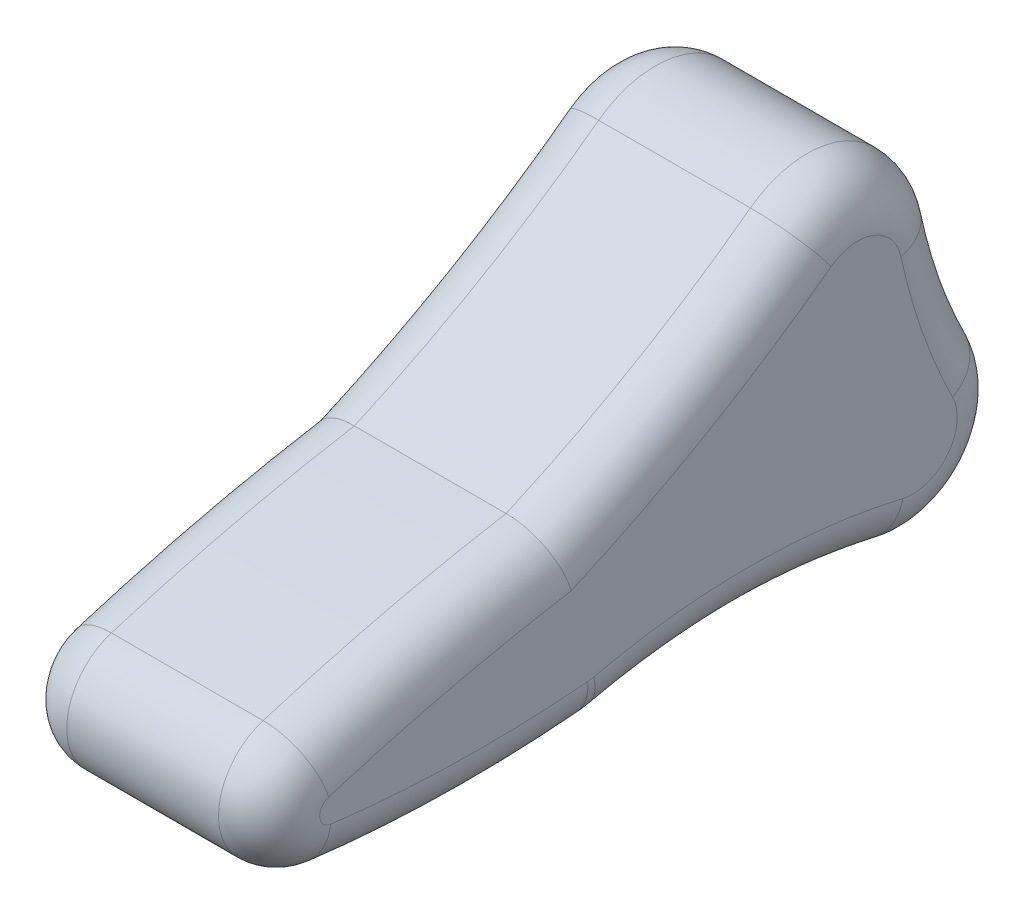
ISO-10303-21;
HEADER;
FILE_DESCRIPTION(('STEP AP214'),'2;1');
FILE_NAME('part.step','',(''),(''),'','','');
FILE_SCHEMA(('AUTOMOTIVE_DESIGN { 1 0 10303 214 1 1 1 1 }'));
ENDSEC;
DATA;
#1=APPLICATION_CONTEXT('core data for automotive mechanical design processes');
#2=APPLICATION_PROTOCOL_DEFINITION('international standard','automotive_design',2000,#1);
#3=PRODUCT_CONTEXT('',#1,'mechanical');
#4=PRODUCT('Part','Part','',(#3));
#5=PRODUCT_RELATED_PRODUCT_CATEGORY('part','',(#4));
#6=PRODUCT_DEFINITION_FORMATION('','',#4);
#7=PRODUCT_DEFINITION_CONTEXT('part definition',#1,'design');
#8=PRODUCT_DEFINITION('design','',#6,#7);
#9=PRODUCT_DEFINITION_SHAPE('','',#8);
#10=(LENGTH_UNIT() NAMED_UNIT(*) SI_UNIT(.MILLI.,.METRE.));
#11=(NAMED_UNIT(*) PLANE_ANGLE_UNIT() SI_UNIT($,.RADIAN.));
#12=(NAMED_UNIT(*) SI_UNIT($,.STERADIAN.) SOLID_ANGLE_UNIT());
#13=UNCERTAINTY_MEASURE_WITH_UNIT(LENGTH_MEASURE(1.E-05),#10,'distance_accuracy_value','');
#14=(GEOMETRIC_REPRESENTATION_CONTEXT(3) GLOBAL_UNCERTAINTY_ASSIGNED_CONTEXT((#13)) GLOBAL_UNIT_ASSIGNED_CONTEXT((#10,
#11,#12)) REPRESENTATION_CONTEXT('',''));
#15=CARTESIAN_POINT('',(0.,0.,0.));
#16=DIRECTION('',(0.,0.,1.));
#17=DIRECTION('',(1.,0.,0.));
#18=AXIS2_PLACEMENT_3D('',#15,#16,#17);
#19=CARTESIAN_POINT('',(165.1,-721.036665442336,300.274692445142));
#20=DIRECTION('',(-1.,0.,0.));
#21=DIRECTION('',(0.,0.,1.));
#22=AXIS2_PLACEMENT_3D('',#19,#20,#21);
#23=CYLINDRICAL_SURFACE('',#22,508.);
#24=DIRECTION('',(-1.,0.,0.));
#25=VECTOR('',#24,1.);
#26=CARTESIAN_POINT('',(114.3,-1185.70392378103,94.9740859482165));
#27=LINE('',#26,#25);
#28=CARTESIAN_POINT('',(144.78,-1185.70392378103,94.9740859482165));
#29=VERTEX_POINT('',#28);
#30=CARTESIAN_POINT('',(83.82,-1185.70392378103,94.9740859482165));
#31=VERTEX_POINT('',#30);
#32=EDGE_CURVE('E370',#29,#31,#27,.T.);
#33=ORIENTED_EDGE('',*,*,#32,.F.);
#34=CARTESIAN_POINT('',(144.78,-721.036665442336,300.274692445142));
#35=DIRECTION('',(-1.,0.,0.));
#36=DIRECTION('',(0.,0.,1.));
#37=AXIS2_PLACEMENT_3D('',#34,#35,#36);
#38=CIRCLE('',#37,508.);
#39=CARTESIAN_POINT('',(144.78,-1128.45838360628,-3.15823847756048));
#40=VERTEX_POINT('',#39);
#41=EDGE_CURVE('E223',#29,#40,#38,.F.);
#42=ORIENTED_EDGE('',*,*,#41,.T.);
#43=DIRECTION('',(-1.,0.,0.));
#44=VECTOR('',#43,1.);
#45=CARTESIAN_POINT('',(165.1,-1128.45838360628,-3.15823847756048));
#46=LINE('',#45,#44);
#47=CARTESIAN_POINT('',(83.82,-1128.45838360628,-3.15823847756048));
#48=VERTEX_POINT('',#47);
#49=EDGE_CURVE('E342',#40,#48,#46,.T.);
#50=ORIENTED_EDGE('',*,*,#49,.T.);
#51=CARTESIAN_POINT('',(83.82,-721.036665442336,300.274692445142));
#52=DIRECTION('',(-1.,0.,0.));
#53=DIRECTION('',(0.,0.,1.));
#54=AXIS2_PLACEMENT_3D('',#51,#52,#53);
#55=CIRCLE('',#54,508.);
#56=EDGE_CURVE('E221',#48,#31,#55,.T.);
#57=ORIENTED_EDGE('',*,*,#56,.T.);
#58=EDGE_LOOP('',(#33,#42,#50,#57));
#59=FACE_BOUND('',#58,.T.);
#60=ADVANCED_FACE('F33',(#59),#23,.F.);
#61=CARTESIAN_POINT('',(165.1,-1103.40350261757,-286.75330139272));
#62=DIRECTION('',(-1.,0.,0.));
#63=DIRECTION('',(0.,0.,1.));
#64=AXIS2_PLACEMENT_3D('',#61,#62,#63);
#65=CYLINDRICAL_SURFACE('',#64,228.6);
#66=DIRECTION('',(-1.,0.,0.));
#67=VECTOR('',#66,1.);
#68=CARTESIAN_POINT('',(165.1,-1151.07051106129,-63.1782215961856));
#69=LINE('',#68,#67);
#70=CARTESIAN_POINT('',(144.78,-1151.07051106129,-63.1782215961856));
#71=VERTEX_POINT('',#70);
#72=CARTESIAN_POINT('',(83.82,-1151.07051106129,-63.1782215961856));
#73=VERTEX_POINT('',#72);
#74=EDGE_CURVE('E178',#71,#73,#69,.T.);
#75=ORIENTED_EDGE('',*,*,#74,.F.);
#76=CARTESIAN_POINT('',(144.78,-1103.40350261757,-286.75330139272));
#77=DIRECTION('',(-1.,0.,0.));
#78=DIRECTION('',(0.,0.,1.));
#79=AXIS2_PLACEMENT_3D('',#76,#77,#78);
#80=CIRCLE('',#79,228.6);
#81=CARTESIAN_POINT('',(144.78,-1205.49908248986,-82.2185792291186));
#82=VERTEX_POINT('',#81);
#83=EDGE_CURVE('E194',#71,#82,#80,.F.);
#84=ORIENTED_EDGE('',*,*,#83,.T.);
#85=DIRECTION('',(-1.,0.,0.));
#86=VECTOR('',#85,1.);
#87=CARTESIAN_POINT('',(165.1,-1205.49908248986,-82.2185792291186));
#88=LINE('',#87,#86);
#89=CARTESIAN_POINT('',(83.82,-1205.49908248986,-82.2185792291186));
#90=VERTEX_POINT('',#89);
#91=EDGE_CURVE('E337',#82,#90,#88,.T.);
#92=ORIENTED_EDGE('',*,*,#91,.T.);
#93=CARTESIAN_POINT('',(83.82,-1103.40350261757,-286.75330139272));
#94=DIRECTION('',(-1.,0.,0.));
#95=DIRECTION('',(0.,0.,1.));
#96=AXIS2_PLACEMENT_3D('',#93,#94,#95);
#97=CIRCLE('',#96,228.6);
#98=EDGE_CURVE('E192',#90,#73,#97,.T.);
#99=ORIENTED_EDGE('',*,*,#98,.T.);
#100=EDGE_LOOP('',(#75,#84,#92,#99));
#101=FACE_BOUND('',#100,.T.);
#102=ADVANCED_FACE('F335',(#101),#65,.F.);
#103=CARTESIAN_POINT('',(165.1,-1159.01501246857,-25.9157082967632));
#104=DIRECTION('',(-1.,0.,0.));
#105=DIRECTION('',(0.,0.,1.));
#106=AXIS2_PLACEMENT_3D('',#103,#104,#105);
#107=CYLINDRICAL_SURFACE('',#106,38.1);
#108=ORIENTED_EDGE('',*,*,#49,.F.);
#109=CARTESIAN_POINT('',(144.78,-1159.01501246857,-25.9157082967632));
#110=DIRECTION('',(-1.,0.,0.));
#111=DIRECTION('',(0.,0.,1.));
#112=AXIS2_PLACEMENT_3D('',#109,#110,#111);
#113=CIRCLE('',#112,38.1);
#114=EDGE_CURVE('E165',#40,#71,#113,.T.);
#115=ORIENTED_EDGE('',*,*,#114,.T.);
#116=ORIENTED_EDGE('',*,*,#74,.T.);
#117=CARTESIAN_POINT('',(83.82,-1159.01501246857,-25.9157082967632));
#118=DIRECTION('',(-1.,0.,0.));
#119=DIRECTION('',(0.,0.,1.));
#120=AXIS2_PLACEMENT_3D('',#117,#118,#119);
#121=CIRCLE('',#120,38.1);
#122=EDGE_CURVE('E184',#73,#48,#121,.F.);
#123=ORIENTED_EDGE('',*,*,#122,.T.);
#124=EDGE_LOOP('',(#108,#115,#116,#123));
#125=FACE_BOUND('',#124,.T.);
#126=ADVANCED_FACE('F340',(#125),#107,.T.);
#127=CARTESIAN_POINT('',(165.1,-1222.51501246857,84.0695179838607));
#128=DIRECTION('',(-1.,0.,0.));
#129=DIRECTION('',(0.,0.,1.));
#130=AXIS2_PLACEMENT_3D('',#127,#128,#129);
#131=CYLINDRICAL_SURFACE('',#130,38.1000000000002);
#132=DIRECTION('',(-1.,0.,0.));
#133=VECTOR('',#132,1.);
#134=CARTESIAN_POINT('',(165.1,-1259.62669209869,75.4478455804447));
#135=LINE('',#134,#133);
#136=CARTESIAN_POINT('',(144.78,-1259.62669209869,75.4478455804447));
#137=VERTEX_POINT('',#136);
#138=CARTESIAN_POINT('',(83.82,-1259.62669209869,75.4478455804447));
#139=VERTEX_POINT('',#138);
#140=EDGE_CURVE('E344',#137,#139,#135,.T.);
#141=ORIENTED_EDGE('',*,*,#140,.F.);
#142=CARTESIAN_POINT('',(144.78,-1222.51501246857,84.0695179838607));
#143=DIRECTION('',(-1.,0.,0.));
#144=DIRECTION('',(0.,0.,1.));
#145=AXIS2_PLACEMENT_3D('',#142,#143,#144);
#146=CIRCLE('',#145,38.1000000000002);
#147=CARTESIAN_POINT('',(144.78,-1260.4716735161,80.7677181529781));
#148=VERTEX_POINT('',#147);
#149=EDGE_CURVE('E206',#137,#148,#146,.T.);
#150=ORIENTED_EDGE('',*,*,#149,.T.);
#151=DIRECTION('',(-1.,0.,0.));
#152=VECTOR('',#151,1.);
#153=CARTESIAN_POINT('',(165.1,-1260.4716735161,80.7677181529781));
#154=LINE('',#153,#152);
#155=CARTESIAN_POINT('',(83.82,-1260.4716735161,80.7677181529781));
#156=VERTEX_POINT('',#155);
#157=EDGE_CURVE('E401',#148,#156,#154,.T.);
#158=ORIENTED_EDGE('',*,*,#157,.T.);
#159=CARTESIAN_POINT('',(83.82,-1222.51501246857,84.0695179838607));
#160=DIRECTION('',(-1.,0.,0.));
#161=DIRECTION('',(0.,0.,1.));
#162=AXIS2_PLACEMENT_3D('',#159,#160,#161);
#163=CIRCLE('',#162,38.1000000000002);
#164=EDGE_CURVE('E204',#156,#139,#163,.F.);
#165=ORIENTED_EDGE('',*,*,#164,.T.);
#166=EDGE_LOOP('',(#141,#150,#158,#165));
#167=FACE_BOUND('',#166,.T.);
#168=ADVANCED_FACE('F423',(#167),#131,.T.);
#169=CARTESIAN_POINT('',(165.1,-1507.03788963278,17.9700295576713));
#170=DIRECTION('',(-1.,0.,0.));
#171=DIRECTION('',(0.,0.,1.));
#172=AXIS2_PLACEMENT_3D('',#169,#170,#171);
#173=CYLINDRICAL_SURFACE('',#172,254.);
#174=DIRECTION('',(-1.,0.,0.));
#175=VECTOR('',#174,1.);
#176=CARTESIAN_POINT('',(165.1,-1259.62669209869,-39.5077864651021));
#177=LINE('',#176,#175);
#178=CARTESIAN_POINT('',(144.78,-1259.62669209869,-39.5077864651021));
#179=VERTEX_POINT('',#178);
#180=CARTESIAN_POINT('',(83.82,-1259.62669209869,-39.5077864651021));
#181=VERTEX_POINT('',#180);
#182=EDGE_CURVE('E369',#179,#181,#177,.T.);
#183=ORIENTED_EDGE('',*,*,#182,.F.);
#184=CARTESIAN_POINT('',(144.78,-1507.03788963278,17.9700295576713));
#185=DIRECTION('',(-1.,0.,0.));
#186=DIRECTION('',(0.,0.,1.));
#187=AXIS2_PLACEMENT_3D('',#184,#185,#186);
#188=CIRCLE('',#187,254.);
#189=EDGE_CURVE('E202',#179,#137,#188,.F.);
#190=ORIENTED_EDGE('',*,*,#189,.T.);
#191=ORIENTED_EDGE('',*,*,#140,.T.);
#192=CARTESIAN_POINT('',(83.82,-1507.03788963278,17.9700295576713));
#193=DIRECTION('',(-1.,0.,0.));
#194=DIRECTION('',(0.,0.,1.));
#195=AXIS2_PLACEMENT_3D('',#192,#193,#194);
#196=CIRCLE('',#195,254.);
#197=EDGE_CURVE('E200',#139,#181,#196,.T.);
#198=ORIENTED_EDGE('',*,*,#197,.T.);
#199=EDGE_LOOP('',(#183,#190,#191,#198));
#200=FACE_BOUND('',#199,.T.);
#201=ADVANCED_FACE('F381',(#200),#173,.F.);
#202=CARTESIAN_POINT('',(165.1,-1222.51501246857,-48.1294588685182));
#203=DIRECTION('',(-1.,0.,0.));
#204=DIRECTION('',(0.,0.,1.));
#205=AXIS2_PLACEMENT_3D('',#202,#203,#204);
#206=CYLINDRICAL_SURFACE('',#205,38.1000000000002);
#207=ORIENTED_EDGE('',*,*,#91,.F.);
#208=CARTESIAN_POINT('',(144.78,-1222.51501246857,-48.1294588685182));
#209=DIRECTION('',(-1.,0.,0.));
#210=DIRECTION('',(0.,0.,1.));
#211=AXIS2_PLACEMENT_3D('',#208,#209,#210);
#212=CIRCLE('',#211,38.1000000000002);
#213=EDGE_CURVE('E198',#82,#179,#212,.T.);
#214=ORIENTED_EDGE('',*,*,#213,.T.);
#215=ORIENTED_EDGE('',*,*,#182,.T.);
#216=CARTESIAN_POINT('',(83.82,-1222.51501246857,-48.1294588685182));
#217=DIRECTION('',(-1.,0.,0.));
#218=DIRECTION('',(0.,0.,1.));
#219=AXIS2_PLACEMENT_3D('',#216,#217,#218);
#220=CIRCLE('',#219,38.1000000000002);
#221=EDGE_CURVE('E196',#181,#90,#220,.F.);
#222=ORIENTED_EDGE('',*,*,#221,.T.);
#223=EDGE_LOOP('',(#207,#214,#215,#222));
#224=FACE_BOUND('',#223,.T.);
#225=ADVANCED_FACE('F366',(#224),#206,.T.);
#226=CARTESIAN_POINT('',(165.1,-1131.20925754307,-156.334504844742));
#227=DIRECTION('',(-1.,0.,0.));
#228=DIRECTION('',(0.,0.,1.));
#229=AXIS2_PLACEMENT_3D('',#226,#227,#228);
#230=PLANE('',#229);
#231=CARTESIAN_POINT('',(165.1,-1103.40350261757,-286.75330139272));
#232=DIRECTION('',(-1.,0.,0.));
#233=DIRECTION('',(0.,0.,1.));
#234=AXIS2_PLACEMENT_3D('',#231,#232,#233);
#235=CIRCLE('',#234,248.92);
#236=CARTESIAN_POINT('',(165.1,-1214.57424514517,-64.0377150367985));
#237=VERTEX_POINT('',#236);
#238=CARTESIAN_POINT('',(165.1,-1155.30757847851,-43.304881169827));
#239=VERTEX_POINT('',#238);
#240=EDGE_CURVE('E182',#237,#239,#235,.T.);
#241=ORIENTED_EDGE('',*,*,#240,.T.);
#242=CARTESIAN_POINT('',(165.1,-1159.01501246857,-25.9157082967632));
#243=DIRECTION('',(-1.,0.,0.));
#244=DIRECTION('',(0.,0.,1.));
#245=AXIS2_PLACEMENT_3D('',#242,#243,#244);
#246=CIRCLE('',#245,17.78);
#247=CARTESIAN_POINT('',(165.1,-1144.75525233284,-15.2955557144687));
#248=VERTEX_POINT('',#247);
#249=EDGE_CURVE('E163',#239,#248,#246,.F.);
#250=ORIENTED_EDGE('',*,*,#249,.T.);
#251=CARTESIAN_POINT('',(165.1,-721.036665442336,300.274692445142));
#252=DIRECTION('',(-1.,0.,0.));
#253=DIRECTION('',(0.,0.,1.));
#254=AXIS2_PLACEMENT_3D('',#251,#252,#253);
#255=CIRCLE('',#254,528.32);
#256=CARTESIAN_POINT('',(165.1,-1205.32684173991,89.1229755644506));
#257=VERTEX_POINT('',#256);
#258=EDGE_CURVE('E171',#248,#257,#255,.T.);
#259=ORIENTED_EDGE('',*,*,#258,.T.);
#260=CARTESIAN_POINT('',(165.1,-1937.01800195655,-32.1917739956208));
#261=DIRECTION('',(-1.,0.,0.));
#262=DIRECTION('',(0.,0.,1.));
#263=AXIS2_PLACEMENT_3D('',#260,#261,#262);
#264=CIRCLE('',#263,741.68);
#265=CARTESIAN_POINT('',(165.1,-1228.34510342367,186.604810267022));
#266=VERTEX_POINT('',#265);
#267=EDGE_CURVE('E177',#257,#266,#264,.F.);
#268=ORIENTED_EDGE('',*,*,#267,.T.);
#269=CARTESIAN_POINT('',(165.1,-1233.19902738622,185.106203525497));
#270=DIRECTION('',(-1.,0.,0.));
#271=DIRECTION('',(0.,0.,1.));
#272=AXIS2_PLACEMENT_3D('',#269,#270,#271);
#273=CIRCLE('',#272,5.07999999999997);
#274=CARTESIAN_POINT('',(165.1,-1238.23919757398,185.741092868943));
#275=VERTEX_POINT('',#274);
#276=EDGE_CURVE('E349',#266,#275,#273,.F.);
#277=ORIENTED_EDGE('',*,*,#276,.T.);
#278=CARTESIAN_POINT('',(165.1,-754.382859549086,124.791715898082));
#279=DIRECTION('',(-1.,0.,0.));
#280=DIRECTION('',(0.,0.,1.));
#281=AXIS2_PLACEMENT_3D('',#278,#279,#280);
#282=CIRCLE('',#281,487.68);
#283=CARTESIAN_POINT('',(165.1,-1240.22812095742,82.5286780627822));
#284=VERTEX_POINT('',#283);
#285=EDGE_CURVE('E351',#275,#284,#282,.F.);
#286=ORIENTED_EDGE('',*,*,#285,.T.);
#287=CARTESIAN_POINT('',(165.1,-1222.51501246857,84.0695179838607));
#288=DIRECTION('',(-1.,0.,0.));
#289=DIRECTION('',(0.,0.,1.));
#290=AXIS2_PLACEMENT_3D('',#287,#288,#289);
#291=CIRCLE('',#290,17.7800000000002);
#292=CARTESIAN_POINT('',(165.1,-1239.83379629596,80.0460708622666));
#293=VERTEX_POINT('',#292);
#294=EDGE_CURVE('E353',#284,#293,#291,.F.);
#295=ORIENTED_EDGE('',*,*,#294,.T.);
#296=CARTESIAN_POINT('',(165.1,-1507.03788963278,17.9700295576713));
#297=DIRECTION('',(-1.,0.,0.));
#298=DIRECTION('',(0.,0.,1.));
#299=AXIS2_PLACEMENT_3D('',#296,#297,#298);
#300=CIRCLE('',#299,274.32);
#301=CARTESIAN_POINT('',(165.1,-1239.83379629596,-44.106011746924));
#302=VERTEX_POINT('',#301);
#303=EDGE_CURVE('E355',#293,#302,#300,.T.);
#304=ORIENTED_EDGE('',*,*,#303,.T.);
#305=CARTESIAN_POINT('',(165.1,-1222.51501246857,-48.1294588685182));
#306=DIRECTION('',(-1.,0.,0.));
#307=DIRECTION('',(0.,0.,1.));
#308=AXIS2_PLACEMENT_3D('',#305,#306,#307);
#309=CIRCLE('',#308,17.7800000000002);
#310=EDGE_CURVE('E187',#302,#237,#309,.F.);
#311=ORIENTED_EDGE('',*,*,#310,.T.);
#312=EDGE_LOOP('',(#241,#250,#259,#268,#277,#286,#295,#304,#311));
#313=FACE_BOUND('',#312,.T.);
#314=ADVANCED_FACE('F180',(#313),#230,.F.);
#315=CARTESIAN_POINT('',(63.5,-1131.20925754307,-156.334504844742));
#316=DIRECTION('',(-1.,0.,0.));
#317=DIRECTION('',(0.,0.,1.));
#318=AXIS2_PLACEMENT_3D('',#315,#316,#317);
#319=PLANE('',#318);
#320=CARTESIAN_POINT('',(63.5,-754.382859549086,124.791715898082));
#321=DIRECTION('',(-1.,0.,0.));
#322=DIRECTION('',(0.,0.,1.));
#323=AXIS2_PLACEMENT_3D('',#320,#321,#322);
#324=CIRCLE('',#323,487.68);
#325=CARTESIAN_POINT('',(63.5,-1240.22812095742,82.5286780627823));
#326=VERTEX_POINT('',#325);
#327=CARTESIAN_POINT('',(63.5,-1238.23919757398,185.741092868943));
#328=VERTEX_POINT('',#327);
#329=EDGE_CURVE('E42',#326,#328,#324,.T.);
#330=ORIENTED_EDGE('',*,*,#329,.T.);
#331=CARTESIAN_POINT('',(63.5,-1233.19902738622,185.106203525497));
#332=DIRECTION('',(-1.,0.,0.));
#333=DIRECTION('',(0.,0.,1.));
#334=AXIS2_PLACEMENT_3D('',#331,#332,#333);
#335=CIRCLE('',#334,5.07999999999997);
#336=CARTESIAN_POINT('',(63.5,-1228.34510342367,186.604810267022));
#337=VERTEX_POINT('',#336);
#338=EDGE_CURVE('E11',#328,#337,#335,.T.);
#339=ORIENTED_EDGE('',*,*,#338,.T.);
#340=CARTESIAN_POINT('',(63.5,-1937.01800195655,-32.1917739956208));
#341=DIRECTION('',(-1.,0.,0.));
#342=DIRECTION('',(0.,0.,1.));
#343=AXIS2_PLACEMENT_3D('',#340,#341,#342);
#344=CIRCLE('',#343,741.68);
#345=CARTESIAN_POINT('',(63.5,-1205.32684173991,89.1229755644506));
#346=VERTEX_POINT('',#345);
#347=EDGE_CURVE('E225',#337,#346,#344,.T.);
#348=ORIENTED_EDGE('',*,*,#347,.T.);
#349=CARTESIAN_POINT('',(63.5,-721.036665442336,300.274692445142));
#350=DIRECTION('',(-1.,0.,0.));
#351=DIRECTION('',(0.,0.,1.));
#352=AXIS2_PLACEMENT_3D('',#349,#350,#351);
#353=CIRCLE('',#352,528.32);
#354=CARTESIAN_POINT('',(63.5,-1144.75525233284,-15.2955557144687));
#355=VERTEX_POINT('',#354);
#356=EDGE_CURVE('E227',#346,#355,#353,.F.);
#357=ORIENTED_EDGE('',*,*,#356,.T.);
#358=CARTESIAN_POINT('',(63.5,-1159.01501246857,-25.9157082967632));
#359=DIRECTION('',(-1.,0.,0.));
#360=DIRECTION('',(0.,0.,1.));
#361=AXIS2_PLACEMENT_3D('',#358,#359,#360);
#362=CIRCLE('',#361,17.78);
#363=CARTESIAN_POINT('',(63.5,-1155.30757847851,-43.304881169827));
#364=VERTEX_POINT('',#363);
#365=EDGE_CURVE('E229',#355,#364,#362,.T.);
#366=ORIENTED_EDGE('',*,*,#365,.T.);
#367=CARTESIAN_POINT('',(63.5,-1103.40350261757,-286.75330139272));
#368=DIRECTION('',(-1.,0.,0.));
#369=DIRECTION('',(0.,0.,1.));
#370=AXIS2_PLACEMENT_3D('',#367,#368,#369);
#371=CIRCLE('',#370,248.92);
#372=CARTESIAN_POINT('',(63.5,-1214.57424514517,-64.0377150367986));
#373=VERTEX_POINT('',#372);
#374=EDGE_CURVE('E231',#364,#373,#371,.F.);
#375=ORIENTED_EDGE('',*,*,#374,.T.);
#376=CARTESIAN_POINT('',(63.5,-1222.51501246857,-48.1294588685182));
#377=DIRECTION('',(-1.,0.,0.));
#378=DIRECTION('',(0.,0.,1.));
#379=AXIS2_PLACEMENT_3D('',#376,#377,#378);
#380=CIRCLE('',#379,17.7800000000002);
#381=CARTESIAN_POINT('',(63.5,-1239.83379629596,-44.106011746924));
#382=VERTEX_POINT('',#381);
#383=EDGE_CURVE('E233',#373,#382,#380,.T.);
#384=ORIENTED_EDGE('',*,*,#383,.T.);
#385=CARTESIAN_POINT('',(63.5,-1507.03788963278,17.9700295576713));
#386=DIRECTION('',(-1.,0.,0.));
#387=DIRECTION('',(0.,0.,1.));
#388=AXIS2_PLACEMENT_3D('',#385,#386,#387);
#389=CIRCLE('',#388,274.32);
#390=CARTESIAN_POINT('',(63.5,-1239.83379629596,80.0460708622665));
#391=VERTEX_POINT('',#390);
#392=EDGE_CURVE('E235',#382,#391,#389,.F.);
#393=ORIENTED_EDGE('',*,*,#392,.T.);
#394=CARTESIAN_POINT('',(63.5,-1222.51501246857,84.0695179838607));
#395=DIRECTION('',(-1.,0.,0.));
#396=DIRECTION('',(0.,0.,1.));
#397=AXIS2_PLACEMENT_3D('',#394,#395,#396);
#398=CIRCLE('',#397,17.7800000000002);
#399=EDGE_CURVE('E53',#391,#326,#398,.T.);
#400=ORIENTED_EDGE('',*,*,#399,.T.);
#401=EDGE_LOOP('',(#330,#339,#348,#357,#366,#375,#384,#393,#400));
#402=FACE_BOUND('',#401,.T.);
#403=ADVANCED_FACE('F439',(#402),#319,.T.);
#404=CARTESIAN_POINT('',(165.1,-1937.01800195655,-32.1917739956208));
#405=DIRECTION('',(-1.,0.,0.));
#406=DIRECTION('',(0.,0.,1.));
#407=AXIS2_PLACEMENT_3D('',#404,#405,#406);
#408=CYLINDRICAL_SURFACE('',#407,762.);
#409=DIRECTION('',(-1.,0.,0.));
#410=VECTOR('',#409,1.);
#411=CARTESIAN_POINT('',(165.1,-1208.92940757345,192.599237233121));
#412=LINE('',#411,#410);
#413=CARTESIAN_POINT('',(144.78,-1208.92940757345,192.599237233121));
#414=VERTEX_POINT('',#413);
#415=CARTESIAN_POINT('',(83.82,-1208.92940757345,192.599237233121));
#416=VERTEX_POINT('',#415);
#417=EDGE_CURVE('E374',#414,#416,#412,.T.);
#418=ORIENTED_EDGE('',*,*,#417,.F.);
#419=CARTESIAN_POINT('',(144.78,-1937.01800195655,-32.1917739956208));
#420=DIRECTION('',(-1.,0.,0.));
#421=DIRECTION('',(0.,0.,1.));
#422=AXIS2_PLACEMENT_3D('',#419,#420,#421);
#423=CIRCLE('',#422,762.);
#424=EDGE_CURVE('E219',#414,#29,#423,.T.);
#425=ORIENTED_EDGE('',*,*,#424,.T.);
#426=ORIENTED_EDGE('',*,*,#32,.T.);
#427=CARTESIAN_POINT('',(83.82,-1937.01800195655,-32.1917739956208));
#428=DIRECTION('',(-1.,0.,0.));
#429=DIRECTION('',(0.,0.,1.));
#430=AXIS2_PLACEMENT_3D('',#427,#428,#429);
#431=CIRCLE('',#430,762.);
#432=EDGE_CURVE('E217',#31,#416,#431,.F.);
#433=ORIENTED_EDGE('',*,*,#432,.T.);
#434=EDGE_LOOP('',(#418,#425,#426,#433));
#435=FACE_BOUND('',#434,.T.);
#436=ADVANCED_FACE('F580',(#435),#408,.T.);
#437=CARTESIAN_POINT('',(165.1,-1233.19902738622,185.106203525497));
#438=DIRECTION('',(-1.,0.,0.));
#439=DIRECTION('',(0.,0.,1.));
#440=AXIS2_PLACEMENT_3D('',#437,#438,#439);
#441=CYLINDRICAL_SURFACE('',#440,25.4);
#442=DIRECTION('',(-1.,0.,0.));
#443=VECTOR('',#442,1.);
#444=CARTESIAN_POINT('',(165.1,-1258.39987832502,188.280650242729));
#445=LINE('',#444,#443);
#446=CARTESIAN_POINT('',(144.78,-1258.39987832502,188.280650242729));
#447=VERTEX_POINT('',#446);
#448=CARTESIAN_POINT('',(83.82,-1258.39987832502,188.280650242729));
#449=VERTEX_POINT('',#448);
#450=EDGE_CURVE('E427',#447,#449,#445,.T.);
#451=ORIENTED_EDGE('',*,*,#450,.F.);
#452=CARTESIAN_POINT('',(144.78,-1233.19902738622,185.106203525497));
#453=DIRECTION('',(-1.,0.,0.));
#454=DIRECTION('',(0.,0.,1.));
#455=AXIS2_PLACEMENT_3D('',#452,#453,#454);
#456=CIRCLE('',#455,25.4);
#457=EDGE_CURVE('E215',#447,#414,#456,.T.);
#458=ORIENTED_EDGE('',*,*,#457,.T.);
#459=ORIENTED_EDGE('',*,*,#417,.T.);
#460=CARTESIAN_POINT('',(83.82,-1233.19902738622,185.106203525497));
#461=DIRECTION('',(-1.,0.,0.));
#462=DIRECTION('',(0.,0.,1.));
#463=AXIS2_PLACEMENT_3D('',#460,#461,#462);
#464=CIRCLE('',#463,25.4);
#465=EDGE_CURVE('E212',#416,#449,#464,.F.);
#466=ORIENTED_EDGE('',*,*,#465,.T.);
#467=EDGE_LOOP('',(#451,#458,#459,#466));
#468=FACE_BOUND('',#467,.T.);
#469=ADVANCED_FACE('F434',(#468),#441,.T.);
#470=CARTESIAN_POINT('',(165.1,-754.382859549086,124.791715898082));
#471=DIRECTION('',(-1.,0.,0.));
#472=DIRECTION('',(0.,0.,1.));
#473=AXIS2_PLACEMENT_3D('',#470,#471,#472);
#474=CYLINDRICAL_SURFACE('',#473,508.);
#475=ORIENTED_EDGE('',*,*,#157,.F.);
#476=CARTESIAN_POINT('',(144.78,-754.382859549086,124.791715898082));
#477=DIRECTION('',(-1.,0.,0.));
#478=DIRECTION('',(0.,0.,1.));
#479=AXIS2_PLACEMENT_3D('',#476,#477,#478);
#480=CIRCLE('',#479,508.);
#481=EDGE_CURVE('E210',#148,#447,#480,.T.);
#482=ORIENTED_EDGE('',*,*,#481,.T.);
#483=ORIENTED_EDGE('',*,*,#450,.T.);
#484=CARTESIAN_POINT('',(83.82,-754.382859549086,124.791715898082));
#485=DIRECTION('',(-1.,0.,0.));
#486=DIRECTION('',(0.,0.,1.));
#487=AXIS2_PLACEMENT_3D('',#484,#485,#486);
#488=CIRCLE('',#487,508.);
#489=EDGE_CURVE('E208',#449,#156,#488,.F.);
#490=ORIENTED_EDGE('',*,*,#489,.T.);
#491=EDGE_LOOP('',(#475,#482,#483,#490));
#492=FACE_BOUND('',#491,.T.);
#493=ADVANCED_FACE('F277',(#492),#474,.T.);
#494=CARTESIAN_POINT('',(144.78,-1222.51501246857,84.0695179838607));
#495=DIRECTION('',(-1.,0.,0.));
#496=DIRECTION('',(0.,0.,1.));
#497=AXIS2_PLACEMENT_3D('',#494,#495,#496);
#498=DEGENERATE_TOROIDAL_SURFACE('',#497,17.7800000000002,20.32,.T.);
#499=CARTESIAN_POINT('',(144.78,-1239.83379629596,80.0460708622666));
#500=DIRECTION('',(0.,0.226290614262887,-0.974059832811376));
#501=DIRECTION('',(0.,0.974059832811376,0.226290614262887));
#502=AXIS2_PLACEMENT_3D('',#499,#500,#501);
#503=CIRCLE('',#502,20.32);
#504=EDGE_CURVE('E402',#293,#137,#503,.T.);
#505=ORIENTED_EDGE('',*,*,#504,.F.);
#506=ORIENTED_EDGE('',*,*,#294,.F.);
#507=CARTESIAN_POINT('',(144.78,-1240.22812095742,82.5286780627822));
#508=DIRECTION('',(0.,-0.0866614128840558,0.996237822769714));
#509=DIRECTION('',(0.,-0.996237822769714,-0.0866614128840558));
#510=AXIS2_PLACEMENT_3D('',#507,#508,#509);
#511=CIRCLE('',#510,20.32);
#512=EDGE_CURVE('E398',#148,#284,#511,.T.);
#513=ORIENTED_EDGE('',*,*,#512,.F.);
#514=ORIENTED_EDGE('',*,*,#149,.F.);
#515=EDGE_LOOP('',(#505,#506,#513,#514));
#516=FACE_BOUND('',#515,.T.);
#517=ADVANCED_FACE('F273',(#516),#498,.T.);
#518=CARTESIAN_POINT('',(144.78,-754.382859549086,124.791715898082));
#519=DIRECTION('',(-1.,0.,0.));
#520=DIRECTION('',(0.,0.,1.));
#521=AXIS2_PLACEMENT_3D('',#518,#519,#520);
#522=TOROIDAL_SURFACE('',#521,487.68,20.32);
#523=ORIENTED_EDGE('',*,*,#512,.T.);
#524=ORIENTED_EDGE('',*,*,#285,.F.);
#525=CARTESIAN_POINT('',(144.78,-1238.23919757398,185.741092868943));
#526=DIRECTION('',(0.,0.124978217213871,0.992159485779399));
#527=DIRECTION('',(0.,-0.9921594857794,0.124978217213871));
#528=AXIS2_PLACEMENT_3D('',#525,#526,#527);
#529=CIRCLE('',#528,20.32);
#530=EDGE_CURVE('E405',#447,#275,#529,.T.);
#531=ORIENTED_EDGE('',*,*,#530,.F.);
#532=ORIENTED_EDGE('',*,*,#481,.F.);
#533=EDGE_LOOP('',(#523,#524,#531,#532));
#534=FACE_BOUND('',#533,.T.);
#535=ADVANCED_FACE('F269',(#534),#522,.T.);
#536=CARTESIAN_POINT('',(144.78,-1507.03788963278,17.9700295576713));
#537=DIRECTION('',(-1.,0.,0.));
#538=DIRECTION('',(0.,0.,1.));
#539=AXIS2_PLACEMENT_3D('',#536,#537,#538);
#540=TOROIDAL_SURFACE('',#539,274.32,20.32);
#541=ORIENTED_EDGE('',*,*,#504,.T.);
#542=ORIENTED_EDGE('',*,*,#189,.F.);
#543=CARTESIAN_POINT('',(144.78,-1239.83379629596,-44.106011746924));
#544=DIRECTION('',(0.,-0.22629061426289,-0.974059832811375));
#545=DIRECTION('',(0.,0.974059832811375,-0.22629061426289));
#546=AXIS2_PLACEMENT_3D('',#543,#544,#545);
#547=CIRCLE('',#546,20.32);
#548=EDGE_CURVE('E408',#302,#179,#547,.T.);
#549=ORIENTED_EDGE('',*,*,#548,.F.);
#550=ORIENTED_EDGE('',*,*,#303,.F.);
#551=EDGE_LOOP('',(#541,#542,#549,#550));
#552=FACE_BOUND('',#551,.T.);
#553=ADVANCED_FACE('F265',(#552),#540,.T.);
#554=CARTESIAN_POINT('',(144.78,-1233.19902738622,185.106203525497));
#555=DIRECTION('',(-1.,0.,0.));
#556=DIRECTION('',(0.,0.,1.));
#557=AXIS2_PLACEMENT_3D('',#554,#555,#556);
#558=DEGENERATE_TOROIDAL_SURFACE('',#557,5.07999999999997,20.32,.T.);
#559=ORIENTED_EDGE('',*,*,#530,.T.);
#560=ORIENTED_EDGE('',*,*,#276,.F.);
#561=CARTESIAN_POINT('',(144.78,-1228.34510342367,186.604810267022));
#562=DIRECTION('',(0.,0.295001327071836,-0.955496843022443));
#563=DIRECTION('',(0.,0.955496843022443,0.295001327071836));
#564=AXIS2_PLACEMENT_3D('',#561,#562,#563);
#565=CIRCLE('',#564,20.32);
#566=EDGE_CURVE('E364',#414,#266,#565,.T.);
#567=ORIENTED_EDGE('',*,*,#566,.F.);
#568=ORIENTED_EDGE('',*,*,#457,.F.);
#569=EDGE_LOOP('',(#559,#560,#567,#568));
#570=FACE_BOUND('',#569,.T.);
#571=ADVANCED_FACE('F261',(#570),#558,.T.);
#572=CARTESIAN_POINT('',(144.78,-1222.51501246857,-48.1294588685182));
#573=DIRECTION('',(-1.,0.,0.));
#574=DIRECTION('',(0.,0.,1.));
#575=AXIS2_PLACEMENT_3D('',#572,#573,#574);
#576=DEGENERATE_TOROIDAL_SURFACE('',#575,17.7800000000002,20.32,.T.);
#577=ORIENTED_EDGE('',*,*,#548,.T.);
#578=ORIENTED_EDGE('',*,*,#213,.F.);
#579=CARTESIAN_POINT('',(144.78,-1214.57424514517,-64.0377150367985));
#580=DIRECTION('',(0.,0.894727568519693,0.446612335399324));
#581=DIRECTION('',(0.,-0.446612335399324,0.894727568519693));
#582=AXIS2_PLACEMENT_3D('',#579,#580,#581);
#583=CIRCLE('',#582,20.32);
#584=EDGE_CURVE('E246',#237,#82,#583,.T.);
#585=ORIENTED_EDGE('',*,*,#584,.F.);
#586=ORIENTED_EDGE('',*,*,#310,.F.);
#587=EDGE_LOOP('',(#577,#578,#585,#586));
#588=FACE_BOUND('',#587,.T.);
#589=ADVANCED_FACE('F258',(#588),#576,.T.);
#590=CARTESIAN_POINT('',(144.78,-1937.01800195655,-32.1917739956208));
#591=DIRECTION('',(-1.,0.,0.));
#592=DIRECTION('',(0.,0.,1.));
#593=AXIS2_PLACEMENT_3D('',#590,#591,#592);
#594=TOROIDAL_SURFACE('',#593,741.68,20.32);
#595=ORIENTED_EDGE('',*,*,#566,.T.);
#596=ORIENTED_EDGE('',*,*,#267,.F.);
#597=CARTESIAN_POINT('',(144.78,-1185.70392378103,94.9740859482165));
#598=CARTESIAN_POINT('',(145.064178495272,-1185.70392333155,94.9740861196647));
#599=CARTESIAN_POINT('',(145.348325221734,-1185.70967812543,94.9723571677887));
#600=CARTESIAN_POINT('',(145.916104054585,-1185.73268049432,94.9654466522557));
#601=CARTESIAN_POINT('',(146.199736173448,-1185.74992778695,94.960265173432));
#602=CARTESIAN_POINT('',(147.049049577823,-1185.81886966539,94.939554060592));
#603=CARTESIAN_POINT('',(147.613304366721,-1185.88776427255,94.9188577436434));
#604=CARTESIAN_POINT('',(148.733214484422,-1186.07084842118,94.8638655025608));
#605=CARTESIAN_POINT('',(149.288877175227,-1186.18499666472,94.8295819779654));
#606=CARTESIAN_POINT('',(150.113202417024,-1186.38949059487,94.7681751610881));
#607=CARTESIAN_POINT('',(150.386460901435,-1186.46320437858,94.7460414690996));
#608=CARTESIAN_POINT('',(150.929562505796,-1186.62161162233,94.6984819405858));
#609=CARTESIAN_POINT('',(151.199404740389,-1186.70630786713,94.673055269076));
#610=CARTESIAN_POINT('',(152.003096217459,-1186.97666337554,94.5919007082373));
#611=CARTESIAN_POINT('',(152.53108373245,-1187.17858283491,94.5313002483165));
#612=CARTESIAN_POINT('',(153.567456448482,-1187.62424973946,94.3975835175755));
#613=CARTESIAN_POINT('',(154.075841560237,-1187.86799737514,94.3244671897557));
#614=CARTESIAN_POINT('',(154.820937989953,-1188.26356618953,94.2058484152683));
#615=CARTESIAN_POINT('',(155.066410899871,-1188.40042714004,94.164814078197));
#616=CARTESIAN_POINT('',(155.551082094473,-1188.68386114675,94.0798478543926));
#617=CARTESIAN_POINT('',(155.790281973171,-1188.83043170163,94.0359167139248));
#618=CARTESIAN_POINT('',(156.497976534402,-1189.284401377,93.8998742763693));
#619=CARTESIAN_POINT('',(156.956613161818,-1189.60608348215,93.8035064731476));
#620=CARTESIAN_POINT('',(157.845630166113,-1190.28619443948,93.5998465654572));
#621=CARTESIAN_POINT('',(158.275910237969,-1190.64474333452,93.4925187822394));
#622=CARTESIAN_POINT('',(159.103617894477,-1191.3951295096,93.2680003042751));
#623=CARTESIAN_POINT('',(159.501045246087,-1191.78696702573,93.1508095395769));
#624=CARTESIAN_POINT('',(160.260469973646,-1192.60130988627,92.9073746224139));
#625=CARTESIAN_POINT('',(160.622456563649,-1193.02382449914,92.781127733962));
#626=CARTESIAN_POINT('',(161.136786511186,-1193.6780817921,92.585737797167));
#627=CARTESIAN_POINT('',(161.303460889443,-1193.89959099177,92.5196018040473));
#628=CARTESIAN_POINT('',(161.62706454036,-1194.34914543439,92.385413564951));
#629=CARTESIAN_POINT('',(161.783991332844,-1194.5771923194,92.3173608376304));
#630=CARTESIAN_POINT('',(162.241889468021,-1195.27383217592,92.1095287918759));
#631=CARTESIAN_POINT('',(162.527525592297,-1195.7518047903,91.9670073340617));
#632=CARTESIAN_POINT('',(163.055984984574,-1196.72905455378,91.675779549412));
#633=CARTESIAN_POINT('',(163.298808173809,-1197.22833174206,91.5270732111986));
#634=CARTESIAN_POINT('',(163.629639847376,-1197.99036867748,91.3002406828777));
#635=CARTESIAN_POINT('',(163.734343595196,-1198.24654906479,91.2240065881061));
#636=CARTESIAN_POINT('',(163.932458340293,-1198.76282748216,91.0704184968799));
#637=CARTESIAN_POINT('',(164.025872006391,-1199.02292456994,90.9930647699512));
#638=CARTESIAN_POINT('',(164.28893930676,-1199.80844017664,90.7595207702727));
#639=CARTESIAN_POINT('',(164.44149988465,-1200.33926887108,90.601792359778));
#640=CARTESIAN_POINT('',(164.657537769958,-1201.23556542778,90.3356359228403));
#641=CARTESIAN_POINT('',(164.733826979321,-1201.59825773772,90.2279783504504));
#642=CARTESIAN_POINT('',(164.865064358834,-1202.32720820759,90.0116957693024));
#643=CARTESIAN_POINT('',(164.920014017817,-1202.69346611693,89.9030708285776));
#644=CARTESIAN_POINT('',(165.008329879395,-1203.42777955179,89.6853800097428));
#645=CARTESIAN_POINT('',(165.041730340459,-1203.79583128214,89.5763151102666));
#646=CARTESIAN_POINT('',(165.08698374201,-1204.53311338305,89.3579286819223));
#647=CARTESIAN_POINT('',(165.098842846972,-1204.90234338612,89.2486072354396));
#648=CARTESIAN_POINT('',(165.099973144214,-1205.28997256752,89.1338867997358));
#649=CARTESIAN_POINT('',(165.10000001502,-1205.30840724024,89.1284310987246));
#650=CARTESIAN_POINT('',(165.1,-1205.32684173991,89.1229755644508));
#651=B_SPLINE_CURVE_WITH_KNOTS('',3,(#597,#598,#599,#600,#601,#602,#603,#604,#605,#606,#607,
#608,#609,#610,#611,#612,#613,#614,#615,#616,#617,#618,#619,#620,#621,#622,#623,#624,#625,#626,
#627,#628,#629,#630,#631,#632,#633,#634,#635,#636,#637,#638,#639,#640,#641,#642,#643,#644,#645,
#646,#647,#648,#649,#650),.UNSPECIFIED.,.F.,.F.,(4,2,2,2,2,2,2,2,2,2,2,2,2,2,2,2,2,2,2,2,2,2,2,
2,2,2,4),(0.,0.852408568037849,1.70479619202682,3.40910360482115,5.11185925336013,
5.96331019946003,6.81497746796469,8.51839386774685,10.2218180254093,11.0736810590654,
11.925325489457,13.6284535691482,15.3373142775467,17.0461871068101,18.7555784036957,
19.610341965791,20.4653221306133,22.1874724593127,23.9096259563242,24.7705796137678,
25.6313293538354,27.352200778531,28.5095195665797,29.6667575954908,30.8221513082633,
31.9772143307883,32.0348893933148),.UNSPECIFIED.);
#652=EDGE_CURVE('E174',#29,#257,#651,.T.);
#653=ORIENTED_EDGE('',*,*,#652,.F.);
#654=ORIENTED_EDGE('',*,*,#424,.F.);
#655=EDGE_LOOP('',(#595,#596,#653,#654));
#656=FACE_BOUND('',#655,.T.);
#657=ADVANCED_FACE('F248',(#656),#594,.T.);
#658=CARTESIAN_POINT('',(144.78,-1103.40350261757,-286.75330139272));
#659=DIRECTION('',(-1.,0.,0.));
#660=DIRECTION('',(0.,0.,1.));
#661=AXIS2_PLACEMENT_3D('',#658,#659,#660);
#662=TOROIDAL_SURFACE('',#661,248.92,20.32);
#663=ORIENTED_EDGE('',*,*,#584,.T.);
#664=ORIENTED_EDGE('',*,*,#83,.F.);
#665=CARTESIAN_POINT('',(144.78,-1155.30757847851,-43.304881169827));
#666=DIRECTION('',(0.,0.978018721769617,0.208517097304094));
#667=DIRECTION('',(0.,-0.208517097304094,0.978018721769617));
#668=AXIS2_PLACEMENT_3D('',#665,#666,#667);
#669=CIRCLE('',#668,20.32);
#670=EDGE_CURVE('E168',#239,#71,#669,.T.);
#671=ORIENTED_EDGE('',*,*,#670,.F.);
#672=ORIENTED_EDGE('',*,*,#240,.F.);
#673=EDGE_LOOP('',(#663,#664,#671,#672));
#674=FACE_BOUND('',#673,.T.);
#675=ADVANCED_FACE('F254',(#674),#662,.T.);
#676=CARTESIAN_POINT('',(144.78,-721.036665442336,300.274692445142));
#677=DIRECTION('',(-1.,0.,0.));
#678=DIRECTION('',(0.,0.,1.));
#679=AXIS2_PLACEMENT_3D('',#676,#677,#678);
#680=TOROIDAL_SURFACE('',#679,528.32,20.32);
#681=ORIENTED_EDGE('',*,*,#652,.T.);
#682=ORIENTED_EDGE('',*,*,#258,.F.);
#683=CARTESIAN_POINT('',(144.78,-1144.75525233284,-15.2955557144686));
#684=DIRECTION('',(0.,0.597308919139178,-0.802011256228232));
#685=DIRECTION('',(0.,0.802011256228232,0.597308919139178));
#686=AXIS2_PLACEMENT_3D('',#683,#684,#685);
#687=CIRCLE('',#686,20.32);
#688=EDGE_CURVE('E159',#40,#248,#687,.T.);
#689=ORIENTED_EDGE('',*,*,#688,.F.);
#690=ORIENTED_EDGE('',*,*,#41,.F.);
#691=EDGE_LOOP('',(#681,#682,#689,#690));
#692=FACE_BOUND('',#691,.T.);
#693=ADVANCED_FACE('F172',(#692),#680,.T.);
#694=CARTESIAN_POINT('',(144.78,-1159.01501246857,-25.9157082967632));
#695=DIRECTION('',(-1.,0.,0.));
#696=DIRECTION('',(0.,0.,1.));
#697=AXIS2_PLACEMENT_3D('',#694,#695,#696);
#698=DEGENERATE_TOROIDAL_SURFACE('',#697,17.78,20.32,.T.);
#699=ORIENTED_EDGE('',*,*,#670,.T.);
#700=ORIENTED_EDGE('',*,*,#114,.F.);
#701=ORIENTED_EDGE('',*,*,#688,.T.);
#702=ORIENTED_EDGE('',*,*,#249,.F.);
#703=EDGE_LOOP('',(#699,#700,#701,#702));
#704=FACE_BOUND('',#703,.T.);
#705=ADVANCED_FACE('F161',(#704),#698,.T.);
#706=CARTESIAN_POINT('',(83.82,-1103.40350261757,-286.75330139272));
#707=DIRECTION('',(-1.,0.,0.));
#708=DIRECTION('',(0.,0.,1.));
#709=AXIS2_PLACEMENT_3D('',#706,#707,#708);
#710=TOROIDAL_SURFACE('',#709,248.92,20.32);
#711=CARTESIAN_POINT('',(83.82,-1155.30757847851,-43.304881169827));
#712=DIRECTION('',(0.,0.978018721769617,0.208517097304094));
#713=DIRECTION('',(0.,-0.208517097304094,0.978018721769617));
#714=AXIS2_PLACEMENT_3D('',#711,#712,#713);
#715=CIRCLE('',#714,20.32);
#716=EDGE_CURVE('E315',#73,#364,#715,.T.);
#717=ORIENTED_EDGE('',*,*,#716,.F.);
#718=ORIENTED_EDGE('',*,*,#98,.F.);
#719=CARTESIAN_POINT('',(83.82,-1214.57424514517,-64.0377150367986));
#720=DIRECTION('',(0.,-0.894727568519693,-0.446612335399324));
#721=DIRECTION('',(0.,0.446612335399324,-0.894727568519693));
#722=AXIS2_PLACEMENT_3D('',#719,#720,#721);
#723=CIRCLE('',#722,20.32);
#724=EDGE_CURVE('E37',#373,#90,#723,.T.);
#725=ORIENTED_EDGE('',*,*,#724,.F.);
#726=ORIENTED_EDGE('',*,*,#374,.F.);
#727=EDGE_LOOP('',(#717,#718,#725,#726));
#728=FACE_BOUND('',#727,.T.);
#729=ADVANCED_FACE('F35',(#728),#710,.T.);
#730=CARTESIAN_POINT('',(83.82,-1222.51501246857,-48.1294588685182));
#731=DIRECTION('',(-1.,0.,0.));
#732=DIRECTION('',(0.,0.,1.));
#733=AXIS2_PLACEMENT_3D('',#730,#731,#732);
#734=DEGENERATE_TOROIDAL_SURFACE('',#733,17.7800000000002,20.32,.T.);
#735=ORIENTED_EDGE('',*,*,#724,.T.);
#736=ORIENTED_EDGE('',*,*,#221,.F.);
#737=CARTESIAN_POINT('',(83.82,-1239.83379629596,-44.106011746924));
#738=DIRECTION('',(0.,0.226290614262889,0.974059832811375));
#739=DIRECTION('',(0.,-0.974059832811375,0.226290614262889));
#740=AXIS2_PLACEMENT_3D('',#737,#738,#739);
#741=CIRCLE('',#740,20.32);
#742=EDGE_CURVE('E313',#382,#181,#741,.T.);
#743=ORIENTED_EDGE('',*,*,#742,.F.);
#744=ORIENTED_EDGE('',*,*,#383,.F.);
#745=EDGE_LOOP('',(#735,#736,#743,#744));
#746=FACE_BOUND('',#745,.T.);
#747=ADVANCED_FACE('F326',(#746),#734,.T.);
#748=CARTESIAN_POINT('',(83.82,-1159.01501246857,-25.9157082967632));
#749=DIRECTION('',(-1.,0.,0.));
#750=DIRECTION('',(0.,0.,1.));
#751=AXIS2_PLACEMENT_3D('',#748,#749,#750);
#752=DEGENERATE_TOROIDAL_SURFACE('',#751,17.78,20.32,.T.);
#753=ORIENTED_EDGE('',*,*,#716,.T.);
#754=ORIENTED_EDGE('',*,*,#365,.F.);
#755=CARTESIAN_POINT('',(83.82,-1144.75525233284,-15.2955557144686));
#756=DIRECTION('',(0.,-0.597308919139179,0.802011256228231));
#757=DIRECTION('',(0.,-0.802011256228231,-0.597308919139179));
#758=AXIS2_PLACEMENT_3D('',#755,#756,#757);
#759=CIRCLE('',#758,20.32);
#760=EDGE_CURVE('E310',#48,#355,#759,.T.);
#761=ORIENTED_EDGE('',*,*,#760,.F.);
#762=ORIENTED_EDGE('',*,*,#122,.F.);
#763=EDGE_LOOP('',(#753,#754,#761,#762));
#764=FACE_BOUND('',#763,.T.);
#765=ADVANCED_FACE('F444',(#764),#752,.T.);
#766=CARTESIAN_POINT('',(83.82,-1507.03788963278,17.9700295576713));
#767=DIRECTION('',(-1.,0.,0.));
#768=DIRECTION('',(0.,0.,1.));
#769=AXIS2_PLACEMENT_3D('',#766,#767,#768);
#770=TOROIDAL_SURFACE('',#769,274.32,20.32);
#771=ORIENTED_EDGE('',*,*,#742,.T.);
#772=ORIENTED_EDGE('',*,*,#197,.F.);
#773=CARTESIAN_POINT('',(83.82,-1239.83379629596,80.0460708622665));
#774=DIRECTION('',(0.,-0.226290614262886,0.974059832811376));
#775=DIRECTION('',(0.,-0.974059832811376,-0.226290614262886));
#776=AXIS2_PLACEMENT_3D('',#773,#774,#775);
#777=CIRCLE('',#776,20.32);
#778=EDGE_CURVE('E305',#391,#139,#777,.T.);
#779=ORIENTED_EDGE('',*,*,#778,.F.);
#780=ORIENTED_EDGE('',*,*,#392,.F.);
#781=EDGE_LOOP('',(#771,#772,#779,#780));
#782=FACE_BOUND('',#781,.T.);
#783=ADVANCED_FACE('F293',(#782),#770,.T.);
#784=CARTESIAN_POINT('',(83.82,-721.036665442336,300.274692445142));
#785=DIRECTION('',(-1.,0.,0.));
#786=DIRECTION('',(0.,0.,1.));
#787=AXIS2_PLACEMENT_3D('',#784,#785,#786);
#788=TOROIDAL_SURFACE('',#787,528.32,20.32);
#789=ORIENTED_EDGE('',*,*,#760,.T.);
#790=ORIENTED_EDGE('',*,*,#356,.F.);
#791=CARTESIAN_POINT('',(83.82,-1185.70392378103,94.9740859482165));
#792=CARTESIAN_POINT('',(83.5358215047281,-1185.70392333155,94.9740861196644));
#793=CARTESIAN_POINT('',(83.2516747782661,-1185.70967812543,94.9723571677884));
#794=CARTESIAN_POINT('',(82.6838959454146,-1185.73268049432,94.9654466522557));
#795=CARTESIAN_POINT('',(82.400263826552,-1185.74992778695,94.9602651734321));
#796=CARTESIAN_POINT('',(81.5509504221773,-1185.81886966539,94.9395540605923));
#797=CARTESIAN_POINT('',(80.986695633279,-1185.88776427255,94.9188577436433));
#798=CARTESIAN_POINT('',(79.8667855155778,-1186.07084842118,94.8638655025605));
#799=CARTESIAN_POINT('',(79.3111228247734,-1186.18499666472,94.8295819779653));
#800=CARTESIAN_POINT('',(78.486797582976,-1186.38949059487,94.7681751610881));
#801=CARTESIAN_POINT('',(78.213539098565,-1186.46320437858,94.7460414690996));
#802=CARTESIAN_POINT('',(77.6704374942039,-1186.62161162233,94.6984819405858));
#803=CARTESIAN_POINT('',(77.4005952596108,-1186.70630786713,94.6730552690761));
#804=CARTESIAN_POINT('',(76.5969037825407,-1186.97666337554,94.5919007082372));
#805=CARTESIAN_POINT('',(76.0689162675502,-1187.17858283491,94.5313002483161));
#806=CARTESIAN_POINT('',(75.0325435515183,-1187.62424973946,94.3975835175751));
#807=CARTESIAN_POINT('',(74.5241584397628,-1187.86799737514,94.3244671897558));
#808=CARTESIAN_POINT('',(73.7790620100474,-1188.26356618952,94.2058484152685));
#809=CARTESIAN_POINT('',(73.5335891001287,-1188.40042714004,94.1648140781972));
#810=CARTESIAN_POINT('',(73.0489179055275,-1188.68386114675,94.0798478543927));
#811=CARTESIAN_POINT('',(72.8097180268292,-1188.83043170163,94.0359167139248));
#812=CARTESIAN_POINT('',(72.1020234655981,-1189.284401377,93.8998742763694));
#813=CARTESIAN_POINT('',(71.643386838182,-1189.60608348215,93.8035064731478));
#814=CARTESIAN_POINT('',(70.7543698338866,-1190.28619443948,93.5998465654574));
#815=CARTESIAN_POINT('',(70.3240897620315,-1190.64474333452,93.4925187822394));
#816=CARTESIAN_POINT('',(69.4963821055235,-1191.3951295096,93.268000304275));
#817=CARTESIAN_POINT('',(69.0989547539132,-1191.78696702573,93.1508095395768));
#818=CARTESIAN_POINT('',(68.3395300263536,-1192.60130988627,92.9073746224138));
#819=CARTESIAN_POINT('',(67.977543436351,-1193.02382449914,92.7811277339617));
#820=CARTESIAN_POINT('',(67.4632134888142,-1193.6780817921,92.5857377971668));
#821=CARTESIAN_POINT('',(67.2965391105575,-1193.89959099177,92.5196018040471));
#822=CARTESIAN_POINT('',(66.9729354596397,-1194.34914543439,92.385413564951));
#823=CARTESIAN_POINT('',(66.8160086671556,-1194.5771923194,92.3173608376304));
#824=CARTESIAN_POINT('',(66.3581105319786,-1195.27383217592,92.109528791876));
#825=CARTESIAN_POINT('',(66.072474407703,-1195.7518047903,91.9670073340618));
#826=CARTESIAN_POINT('',(65.5440150154264,-1196.72905455378,91.6757795494124));
#827=CARTESIAN_POINT('',(65.3011918261909,-1197.22833174206,91.5270732111993));
#828=CARTESIAN_POINT('',(64.9703601526245,-1197.99036867748,91.3002406828779));
#829=CARTESIAN_POINT('',(64.8656564048043,-1198.24654906479,91.2240065881061));
#830=CARTESIAN_POINT('',(64.6675416597071,-1198.76282748216,91.0704184968798));
#831=CARTESIAN_POINT('',(64.5741279936093,-1199.02292456994,90.9930647699513));
#832=CARTESIAN_POINT('',(64.3110606932402,-1199.80844017664,90.7595207702729));
#833=CARTESIAN_POINT('',(64.1585001153505,-1200.33926887108,90.6017923597774));
#834=CARTESIAN_POINT('',(63.9424622300419,-1201.23556542778,90.3356359228399));
#835=CARTESIAN_POINT('',(63.8661730206792,-1201.59825773772,90.2279783504505));
#836=CARTESIAN_POINT('',(63.7349356411661,-1202.32720820759,90.0116957693024));
#837=CARTESIAN_POINT('',(63.6799859821831,-1202.69346611693,89.9030708285768));
#838=CARTESIAN_POINT('',(63.5916701206045,-1203.42777955179,89.6853800097432));
#839=CARTESIAN_POINT('',(63.558269659541,-1203.79583128214,89.5763151102691));
#840=CARTESIAN_POINT('',(63.5130162579897,-1204.53311338305,89.3579286819204));
#841=CARTESIAN_POINT('',(63.5011571530286,-1204.90234338612,89.2486072354313));
#842=CARTESIAN_POINT('',(63.5000268557858,-1205.28997256752,89.1338867997351));
#843=CARTESIAN_POINT('',(63.4999999849805,-1205.30840724024,89.1284310987243));
#844=CARTESIAN_POINT('',(63.5,-1205.32684173991,89.1229755644509));
#845=B_SPLINE_CURVE_WITH_KNOTS('',3,(#791,#792,#793,#794,#795,#796,#797,#798,#799,#800,#801,
#802,#803,#804,#805,#806,#807,#808,#809,#810,#811,#812,#813,#814,#815,#816,#817,#818,#819,#820,
#821,#822,#823,#824,#825,#826,#827,#828,#829,#830,#831,#832,#833,#834,#835,#836,#837,#838,#839,
#840,#841,#842,#843,#844),.UNSPECIFIED.,.F.,.F.,(4,2,2,2,2,2,2,2,2,2,2,2,2,2,2,2,2,2,2,2,2,2,2,
2,2,2,4),(0.,0.852408568037808,1.70479619202681,3.40910360482113,5.11185925336016,
5.96331019946004,6.81497746796469,8.51839386774676,10.2218180254091,11.0736810590652,
11.9253254894567,13.6284535691482,15.3373142775464,17.0461871068099,18.7555784036955,
19.610341965791,20.4653221306133,22.1874724593129,23.9096259563243,24.7705796137676,
25.6313293538353,27.3522007785311,28.5095195665799,29.666757595491,30.8221513082633,
31.9772143307882,32.0348893933147),.UNSPECIFIED.);
#846=EDGE_CURVE('E298',#31,#346,#845,.T.);
#847=ORIENTED_EDGE('',*,*,#846,.F.);
#848=ORIENTED_EDGE('',*,*,#56,.F.);
#849=EDGE_LOOP('',(#789,#790,#847,#848));
#850=FACE_BOUND('',#849,.T.);
#851=ADVANCED_FACE('F288',(#850),#788,.T.);
#852=CARTESIAN_POINT('',(83.82,-1222.51501246857,84.0695179838607));
#853=DIRECTION('',(-1.,0.,0.));
#854=DIRECTION('',(0.,0.,1.));
#855=AXIS2_PLACEMENT_3D('',#852,#853,#854);
#856=DEGENERATE_TOROIDAL_SURFACE('',#855,17.7800000000002,20.32,.T.);
#857=ORIENTED_EDGE('',*,*,#778,.T.);
#858=ORIENTED_EDGE('',*,*,#164,.F.);
#859=CARTESIAN_POINT('',(83.82,-1240.22812095742,82.5286780627823));
#860=DIRECTION('',(0.,-0.0866614128840633,0.996237822769713));
#861=DIRECTION('',(0.,-0.996237822769713,-0.0866614128840633));
#862=AXIS2_PLACEMENT_3D('',#859,#860,#861);
#863=CIRCLE('',#862,20.32);
#864=EDGE_CURVE('E306',#326,#156,#863,.T.);
#865=ORIENTED_EDGE('',*,*,#864,.F.);
#866=ORIENTED_EDGE('',*,*,#399,.F.);
#867=EDGE_LOOP('',(#857,#858,#865,#866));
#868=FACE_BOUND('',#867,.T.);
#869=ADVANCED_FACE('F292',(#868),#856,.T.);
#870=CARTESIAN_POINT('',(83.82,-1937.01800195655,-32.1917739956208));
#871=DIRECTION('',(-1.,0.,0.));
#872=DIRECTION('',(0.,0.,1.));
#873=AXIS2_PLACEMENT_3D('',#870,#871,#872);
#874=TOROIDAL_SURFACE('',#873,741.68,20.32);
#875=ORIENTED_EDGE('',*,*,#846,.T.);
#876=ORIENTED_EDGE('',*,*,#347,.F.);
#877=CARTESIAN_POINT('',(83.82,-1228.34510342367,186.604810267021));
#878=DIRECTION('',(0.,-0.295001327071839,0.955496843022442));
#879=DIRECTION('',(0.,-0.955496843022442,-0.295001327071839));
#880=AXIS2_PLACEMENT_3D('',#877,#878,#879);
#881=CIRCLE('',#880,20.32);
#882=EDGE_CURVE('E392',#416,#337,#881,.T.);
#883=ORIENTED_EDGE('',*,*,#882,.F.);
#884=ORIENTED_EDGE('',*,*,#432,.F.);
#885=EDGE_LOOP('',(#875,#876,#883,#884));
#886=FACE_BOUND('',#885,.T.);
#887=ADVANCED_FACE('F286',(#886),#874,.T.);
#888=CARTESIAN_POINT('',(83.82,-754.382859549086,124.791715898082));
#889=DIRECTION('',(-1.,0.,0.));
#890=DIRECTION('',(0.,0.,1.));
#891=AXIS2_PLACEMENT_3D('',#888,#889,#890);
#892=TOROIDAL_SURFACE('',#891,487.68,20.32);
#893=ORIENTED_EDGE('',*,*,#864,.T.);
#894=ORIENTED_EDGE('',*,*,#489,.F.);
#895=CARTESIAN_POINT('',(83.82,-1238.23919757398,185.741092868943));
#896=DIRECTION('',(0.,0.124978217213871,0.992159485779399));
#897=DIRECTION('',(0.,-0.9921594857794,0.124978217213871));
#898=AXIS2_PLACEMENT_3D('',#895,#896,#897);
#899=CIRCLE('',#898,20.32);
#900=EDGE_CURVE('E394',#328,#449,#899,.T.);
#901=ORIENTED_EDGE('',*,*,#900,.F.);
#902=ORIENTED_EDGE('',*,*,#329,.F.);
#903=EDGE_LOOP('',(#893,#894,#901,#902));
#904=FACE_BOUND('',#903,.T.);
#905=ADVANCED_FACE('F282',(#904),#892,.T.);
#906=CARTESIAN_POINT('',(83.82,-1233.19902738622,185.106203525497));
#907=DIRECTION('',(-1.,0.,0.));
#908=DIRECTION('',(0.,0.,1.));
#909=AXIS2_PLACEMENT_3D('',#906,#907,#908);
#910=DEGENERATE_TOROIDAL_SURFACE('',#909,5.07999999999997,20.32,.T.);
#911=ORIENTED_EDGE('',*,*,#882,.T.);
#912=ORIENTED_EDGE('',*,*,#338,.F.);
#913=ORIENTED_EDGE('',*,*,#900,.T.);
#914=ORIENTED_EDGE('',*,*,#465,.F.);
#915=EDGE_LOOP('',(#911,#912,#913,#914));
#916=FACE_BOUND('',#915,.T.);
#917=ADVANCED_FACE('F279',(#916),#910,.T.);
#918=CLOSED_SHELL('',(#60,#102,#126,#168,#201,#225,#314,#403,#436,#469,#493,#517,#535,#553,#571,
#589,#657,#675,#693,#705,#729,#747,#765,#783,#851,#869,#887,#905,#917));
#919=MANIFOLD_SOLID_BREP('B2',#918);
#920=ADVANCED_BREP_SHAPE_REPRESENTATION('',(#18,#919),#14);
#921=SHAPE_DEFINITION_REPRESENTATION(#9,#920);
ENDSEC;
END-ISO-10303-21;
